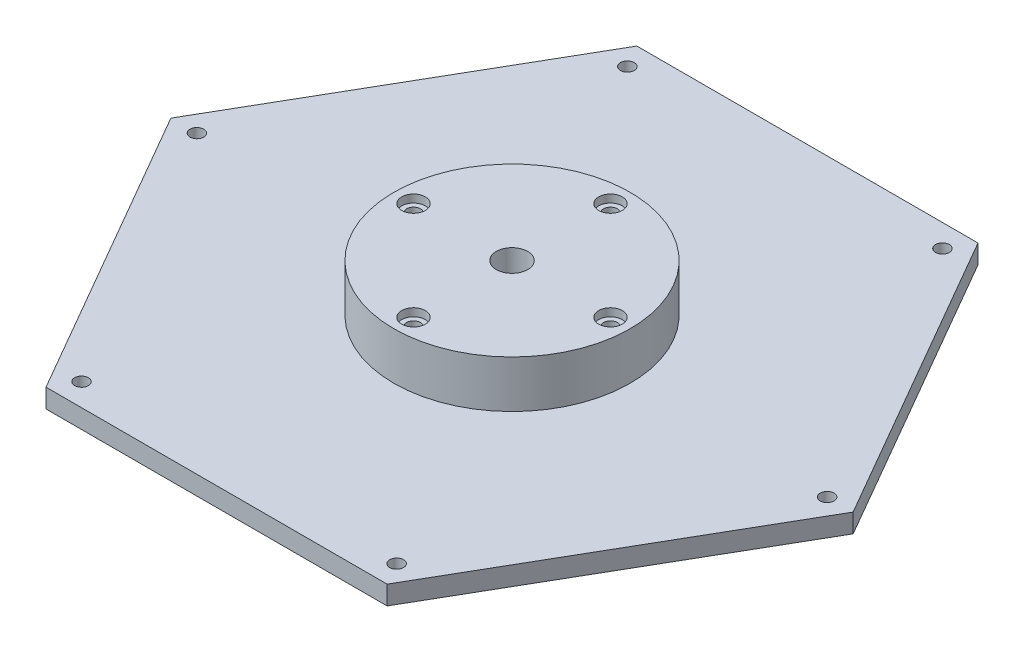
ISO-10303-21;
HEADER;
FILE_DESCRIPTION(('STEP AP214'),'2;1');
FILE_NAME('part.step','',(''),(''),'','','');
FILE_SCHEMA(('AUTOMOTIVE_DESIGN { 1 0 10303 214 1 1 1 1 }'));
ENDSEC;
DATA;
#1=APPLICATION_CONTEXT('core data for automotive mechanical design processes');
#2=APPLICATION_PROTOCOL_DEFINITION('international standard','automotive_design',2000,#1);
#3=PRODUCT_CONTEXT('',#1,'mechanical');
#4=PRODUCT('Part','Part','',(#3));
#5=PRODUCT_RELATED_PRODUCT_CATEGORY('part','',(#4));
#6=PRODUCT_DEFINITION_FORMATION('','',#4);
#7=PRODUCT_DEFINITION_CONTEXT('part definition',#1,'design');
#8=PRODUCT_DEFINITION('design','',#6,#7);
#9=PRODUCT_DEFINITION_SHAPE('','',#8);
#10=(LENGTH_UNIT() NAMED_UNIT(*) SI_UNIT(.MILLI.,.METRE.));
#11=(NAMED_UNIT(*) PLANE_ANGLE_UNIT() SI_UNIT($,.RADIAN.));
#12=(NAMED_UNIT(*) SI_UNIT($,.STERADIAN.) SOLID_ANGLE_UNIT());
#13=UNCERTAINTY_MEASURE_WITH_UNIT(LENGTH_MEASURE(1.E-05),#10,'distance_accuracy_value','');
#14=(GEOMETRIC_REPRESENTATION_CONTEXT(3) GLOBAL_UNCERTAINTY_ASSIGNED_CONTEXT((#13)) GLOBAL_UNIT_ASSIGNED_CONTEXT((#10,
#11,#12)) REPRESENTATION_CONTEXT('',''));
#15=CARTESIAN_POINT('',(0.,0.,0.));
#16=DIRECTION('',(0.,0.,1.));
#17=DIRECTION('',(1.,0.,0.));
#18=AXIS2_PLACEMENT_3D('',#15,#16,#17);
#19=CARTESIAN_POINT('',(25.,-4.94974746832857,0.));
#20=DIRECTION('',(0.,1.,0.));
#21=DIRECTION('',(0.,0.,1.));
#22=AXIS2_PLACEMENT_3D('',#19,#20,#21);
#23=CYLINDRICAL_SURFACE('',#22,1.75);
#24=CARTESIAN_POINT('',(25.,0.,0.));
#25=DIRECTION('',(0.,1.,0.));
#26=DIRECTION('',(0.,0.,1.));
#27=AXIS2_PLACEMENT_3D('',#24,#25,#26);
#28=CIRCLE('',#27,1.75);
#29=CARTESIAN_POINT('',(25.,0.,1.75));
#30=VERTEX_POINT('',#29);
#31=EDGE_CURVE('E189',#30,#30,#28,.F.);
#32=ORIENTED_EDGE('',*,*,#31,.T.);
#33=EDGE_LOOP('',(#32));
#34=FACE_BOUND('',#33,.T.);
#35=CARTESIAN_POINT('',(25.,14.8,0.));
#36=DIRECTION('',(0.,1.,0.));
#37=DIRECTION('',(0.,0.,1.));
#38=AXIS2_PLACEMENT_3D('',#35,#36,#37);
#39=CIRCLE('',#38,1.75);
#40=CARTESIAN_POINT('',(25.,14.8,1.75));
#41=VERTEX_POINT('',#40);
#42=EDGE_CURVE('E42',#41,#41,#39,.F.);
#43=ORIENTED_EDGE('',*,*,#42,.F.);
#44=EDGE_LOOP('',(#43));
#45=FACE_BOUND('',#44,.T.);
#46=ADVANCED_FACE('F38',(#34,#45),#23,.F.);
#47=CARTESIAN_POINT('',(2.61861100413235E-13,-4.94974746832857,-25.));
#48=DIRECTION('',(0.,1.,0.));
#49=DIRECTION('',(0.,0.,1.));
#50=AXIS2_PLACEMENT_3D('',#47,#48,#49);
#51=CYLINDRICAL_SURFACE('',#50,1.75);
#52=CARTESIAN_POINT('',(2.61861100413235E-13,0.,-25.));
#53=DIRECTION('',(0.,1.,0.));
#54=DIRECTION('',(0.,0.,1.));
#55=AXIS2_PLACEMENT_3D('',#52,#53,#54);
#56=CIRCLE('',#55,1.75);
#57=CARTESIAN_POINT('',(2.61861100413235E-13,0.,-23.25));
#58=VERTEX_POINT('',#57);
#59=EDGE_CURVE('E174',#58,#58,#56,.F.);
#60=ORIENTED_EDGE('',*,*,#59,.T.);
#61=EDGE_LOOP('',(#60));
#62=FACE_BOUND('',#61,.T.);
#63=CARTESIAN_POINT('',(2.61861100413235E-13,14.8,-25.));
#64=DIRECTION('',(0.,1.,0.));
#65=DIRECTION('',(0.,0.,1.));
#66=AXIS2_PLACEMENT_3D('',#63,#64,#65);
#67=CIRCLE('',#66,1.75);
#68=CARTESIAN_POINT('',(2.61861100413235E-13,14.8,-23.25));
#69=VERTEX_POINT('',#68);
#70=EDGE_CURVE('E151',#69,#69,#67,.F.);
#71=ORIENTED_EDGE('',*,*,#70,.F.);
#72=EDGE_LOOP('',(#71));
#73=FACE_BOUND('',#72,.T.);
#74=ADVANCED_FACE('F246',(#62,#73),#51,.F.);
#75=CARTESIAN_POINT('',(-25.,-4.94974746832857,-1.74574066942157E-13));
#76=DIRECTION('',(0.,1.,0.));
#77=DIRECTION('',(0.,0.,1.));
#78=AXIS2_PLACEMENT_3D('',#75,#76,#77);
#79=CYLINDRICAL_SURFACE('',#78,1.75);
#80=CARTESIAN_POINT('',(-25.,0.,-1.74574066942157E-13));
#81=DIRECTION('',(0.,1.,0.));
#82=DIRECTION('',(0.,0.,1.));
#83=AXIS2_PLACEMENT_3D('',#80,#81,#82);
#84=CIRCLE('',#83,1.75);
#85=CARTESIAN_POINT('',(-25.,0.,1.74999999999983));
#86=VERTEX_POINT('',#85);
#87=EDGE_CURVE('E180',#86,#86,#84,.F.);
#88=ORIENTED_EDGE('',*,*,#87,.T.);
#89=EDGE_LOOP('',(#88));
#90=FACE_BOUND('',#89,.T.);
#91=CARTESIAN_POINT('',(-25.,14.8,-1.74574066942157E-13));
#92=DIRECTION('',(0.,1.,0.));
#93=DIRECTION('',(0.,0.,1.));
#94=AXIS2_PLACEMENT_3D('',#91,#92,#93);
#95=CIRCLE('',#94,1.75);
#96=CARTESIAN_POINT('',(-25.,14.8,1.74999999999983));
#97=VERTEX_POINT('',#96);
#98=EDGE_CURVE('E148',#97,#97,#95,.F.);
#99=ORIENTED_EDGE('',*,*,#98,.F.);
#100=EDGE_LOOP('',(#99));
#101=FACE_BOUND('',#100,.T.);
#102=ADVANCED_FACE('F253',(#90,#101),#79,.F.);
#103=CARTESIAN_POINT('',(0.,-4.94974746832857,25.));
#104=DIRECTION('',(0.,1.,0.));
#105=DIRECTION('',(0.,0.,1.));
#106=AXIS2_PLACEMENT_3D('',#103,#104,#105);
#107=CYLINDRICAL_SURFACE('',#106,1.75);
#108=CARTESIAN_POINT('',(0.,0.,25.));
#109=DIRECTION('',(0.,1.,0.));
#110=DIRECTION('',(0.,0.,1.));
#111=AXIS2_PLACEMENT_3D('',#108,#109,#110);
#112=CIRCLE('',#111,1.75);
#113=CARTESIAN_POINT('',(0.,0.,26.75));
#114=VERTEX_POINT('',#113);
#115=EDGE_CURVE('E183',#114,#114,#112,.F.);
#116=ORIENTED_EDGE('',*,*,#115,.T.);
#117=EDGE_LOOP('',(#116));
#118=FACE_BOUND('',#117,.T.);
#119=CARTESIAN_POINT('',(0.,14.8,25.));
#120=DIRECTION('',(0.,1.,0.));
#121=DIRECTION('',(0.,0.,1.));
#122=AXIS2_PLACEMENT_3D('',#119,#120,#121);
#123=CIRCLE('',#122,1.75);
#124=CARTESIAN_POINT('',(0.,14.8,26.75));
#125=VERTEX_POINT('',#124);
#126=EDGE_CURVE('E145',#125,#125,#123,.F.);
#127=ORIENTED_EDGE('',*,*,#126,.F.);
#128=EDGE_LOOP('',(#127));
#129=FACE_BOUND('',#128,.T.);
#130=ADVANCED_FACE('F259',(#118,#129),#107,.F.);
#131=CARTESIAN_POINT('',(0.,4.8,0.));
#132=DIRECTION('',(0.,1.,0.));
#133=DIRECTION('',(0.,0.,1.));
#134=AXIS2_PLACEMENT_3D('',#131,#132,#133);
#135=PLANE('',#134);
#136=CARTESIAN_POINT('',(-79.9999999999961,4.8,7.02390780437483E-12));
#137=DIRECTION('',(0.,1.,0.));
#138=DIRECTION('',(0.,0.,1.));
#139=AXIS2_PLACEMENT_3D('',#136,#137,#138);
#140=CIRCLE('',#139,1.75000000000804);
#141=CARTESIAN_POINT('',(-79.9999999999961,4.8,1.75000000001507));
#142=VERTEX_POINT('',#141);
#143=EDGE_CURVE('E209',#142,#142,#140,.T.);
#144=ORIENTED_EDGE('',*,*,#143,.F.);
#145=EDGE_LOOP('',(#144));
#146=FACE_BOUND('',#145,.T.);
#147=CARTESIAN_POINT('',(-39.999999999992,4.8,69.2820323027597));
#148=DIRECTION('',(0.,1.,0.));
#149=DIRECTION('',(0.,0.,1.));
#150=AXIS2_PLACEMENT_3D('',#147,#148,#149);
#151=CIRCLE('',#150,1.75000000000657);
#152=CARTESIAN_POINT('',(-39.999999999992,4.8,71.0320323027663));
#153=VERTEX_POINT('',#152);
#154=EDGE_CURVE('E206',#153,#153,#151,.T.);
#155=ORIENTED_EDGE('',*,*,#154,.F.);
#156=EDGE_LOOP('',(#155));
#157=FACE_BOUND('',#156,.T.);
#158=CARTESIAN_POINT('',(40.000000000008,4.8,69.282032302755));
#159=DIRECTION('',(0.,1.,0.));
#160=DIRECTION('',(0.,0.,1.));
#161=AXIS2_PLACEMENT_3D('',#158,#159,#160);
#162=CIRCLE('',#161,1.75000000000203);
#163=CARTESIAN_POINT('',(40.000000000008,4.8,71.032032302757));
#164=VERTEX_POINT('',#163);
#165=EDGE_CURVE('E203',#164,#164,#162,.T.);
#166=ORIENTED_EDGE('',*,*,#165,.F.);
#167=EDGE_LOOP('',(#166));
#168=FACE_BOUND('',#167,.T.);
#169=CARTESIAN_POINT('',(80.0000000000039,4.8,-2.47318522616396E-12));
#170=DIRECTION('',(0.,1.,0.));
#171=DIRECTION('',(0.,0.,1.));
#172=AXIS2_PLACEMENT_3D('',#169,#170,#171);
#173=CIRCLE('',#172,1.74999999999882);
#174=CARTESIAN_POINT('',(80.0000000000039,4.8,1.74999999999634));
#175=VERTEX_POINT('',#174);
#176=EDGE_CURVE('E200',#175,#175,#173,.T.);
#177=ORIENTED_EDGE('',*,*,#176,.F.);
#178=EDGE_LOOP('',(#177));
#179=FACE_BOUND('',#178,.T.);
#180=CARTESIAN_POINT('',(39.9999999999998,4.8,-69.2820323027552));
#181=DIRECTION('',(0.,1.,0.));
#182=DIRECTION('',(0.,0.,1.));
#183=AXIS2_PLACEMENT_3D('',#180,#181,#182);
#184=CIRCLE('',#183,1.75);
#185=CARTESIAN_POINT('',(39.9999999999998,4.8,-67.5320323027552));
#186=VERTEX_POINT('',#185);
#187=EDGE_CURVE('E197',#186,#186,#184,.T.);
#188=ORIENTED_EDGE('',*,*,#187,.F.);
#189=EDGE_LOOP('',(#188));
#190=FACE_BOUND('',#189,.T.);
#191=CARTESIAN_POINT('',(-40.0000000000002,4.8,-69.2820323027504));
#192=DIRECTION('',(0.,1.,0.));
#193=DIRECTION('',(0.,0.,1.));
#194=AXIS2_PLACEMENT_3D('',#191,#192,#193);
#195=CIRCLE('',#194,1.75000000000515);
#196=CARTESIAN_POINT('',(-40.0000000000002,4.8,-67.5320323027453));
#197=VERTEX_POINT('',#196);
#198=EDGE_CURVE('E194',#197,#197,#195,.T.);
#199=ORIENTED_EDGE('',*,*,#198,.F.);
#200=EDGE_LOOP('',(#199));
#201=FACE_BOUND('',#200,.T.);
#202=CARTESIAN_POINT('',(0.,4.8,0.));
#203=DIRECTION('',(0.,1.,0.));
#204=DIRECTION('',(0.,0.,1.));
#205=AXIS2_PLACEMENT_3D('',#202,#203,#204);
#206=CIRCLE('',#205,30.);
#207=CARTESIAN_POINT('',(0.,4.8,30.));
#208=VERTEX_POINT('',#207);
#209=EDGE_CURVE('E11',#208,#208,#206,.T.);
#210=ORIENTED_EDGE('',*,*,#209,.F.);
#211=EDGE_LOOP('',(#210));
#212=FACE_BOUND('',#211,.T.);
#213=DIRECTION('',(0.499999999999995,0.,-0.866025403784442));
#214=VECTOR('',#213,1.);
#215=CARTESIAN_POINT('',(43.3012701892227,4.8,74.9999999999992));
#216=LINE('',#215,#214);
#217=CARTESIAN_POINT('',(43.3012701892227,4.8,74.9999999999992));
#218=VERTEX_POINT('',#217);
#219=CARTESIAN_POINT('',(86.6025403784436,4.8,0.));
#220=VERTEX_POINT('',#219);
#221=EDGE_CURVE('E137',#218,#220,#216,.T.);
#222=ORIENTED_EDGE('',*,*,#221,.T.);
#223=DIRECTION('',(-0.500000000000001,0.,-0.866025403784438));
#224=VECTOR('',#223,1.);
#225=CARTESIAN_POINT('',(86.6025403784436,4.8,0.));
#226=LINE('',#225,#224);
#227=CARTESIAN_POINT('',(43.3012701892216,4.8,-74.9999999999998));
#228=VERTEX_POINT('',#227);
#229=EDGE_CURVE('E95',#220,#228,#226,.T.);
#230=ORIENTED_EDGE('',*,*,#229,.T.);
#231=DIRECTION('',(-1.,0.,0.));
#232=VECTOR('',#231,1.);
#233=CARTESIAN_POINT('',(43.3012701892216,4.8,-74.9999999999998));
#234=LINE('',#233,#232);
#235=CARTESIAN_POINT('',(-43.3012701892221,4.8,-74.9999999999996));
#236=VERTEX_POINT('',#235);
#237=EDGE_CURVE('E108',#228,#236,#234,.T.);
#238=ORIENTED_EDGE('',*,*,#237,.T.);
#239=DIRECTION('',(-0.499999999999995,0.,0.866025403784442));
#240=VECTOR('',#239,1.);
#241=CARTESIAN_POINT('',(-43.3012701892221,4.8,-74.9999999999996));
#242=LINE('',#241,#240);
#243=CARTESIAN_POINT('',(-86.6025403784436,4.8,6.04742307255489E-13));
#244=VERTEX_POINT('',#243);
#245=EDGE_CURVE('E102',#236,#244,#242,.T.);
#246=ORIENTED_EDGE('',*,*,#245,.T.);
#247=DIRECTION('',(0.500000000000007,0.,0.866025403784435));
#248=VECTOR('',#247,1.);
#249=CARTESIAN_POINT('',(-86.6025403784436,4.8,6.04742307255489E-13));
#250=LINE('',#249,#248);
#251=CARTESIAN_POINT('',(-43.3012701892211,4.8,75.0000000000001));
#252=VERTEX_POINT('',#251);
#253=EDGE_CURVE('E106',#244,#252,#250,.T.);
#254=ORIENTED_EDGE('',*,*,#253,.T.);
#255=DIRECTION('',(1.,0.,0.));
#256=VECTOR('',#255,1.);
#257=CARTESIAN_POINT('',(-43.3012701892211,4.8,75.0000000000001));
#258=LINE('',#257,#256);
#259=EDGE_CURVE('E57',#252,#218,#258,.T.);
#260=ORIENTED_EDGE('',*,*,#259,.T.);
#261=EDGE_LOOP('',(#222,#230,#238,#246,#254,#260));
#262=FACE_BOUND('',#261,.T.);
#263=ADVANCED_FACE('F104',(#146,#157,#168,#179,#190,#201,#212,#262),#135,.T.);
#264=CARTESIAN_POINT('',(0.,0.,0.));
#265=DIRECTION('',(0.,1.,0.));
#266=DIRECTION('',(0.,0.,1.));
#267=AXIS2_PLACEMENT_3D('',#264,#265,#266);
#268=PLANE('',#267);
#269=CARTESIAN_POINT('',(-79.9999999999961,0.,7.02390780437483E-12));
#270=DIRECTION('',(0.,1.,0.));
#271=DIRECTION('',(0.,0.,1.));
#272=AXIS2_PLACEMENT_3D('',#269,#270,#271);
#273=CIRCLE('',#272,1.75000000000804);
#274=CARTESIAN_POINT('',(-79.9999999999961,0.,1.75000000001507));
#275=VERTEX_POINT('',#274);
#276=EDGE_CURVE('E160',#275,#275,#273,.F.);
#277=ORIENTED_EDGE('',*,*,#276,.F.);
#278=EDGE_LOOP('',(#277));
#279=FACE_BOUND('',#278,.T.);
#280=CARTESIAN_POINT('',(-39.999999999992,0.,69.2820323027597));
#281=DIRECTION('',(0.,1.,0.));
#282=DIRECTION('',(0.,0.,1.));
#283=AXIS2_PLACEMENT_3D('',#280,#281,#282);
#284=CIRCLE('',#283,1.75000000000657);
#285=CARTESIAN_POINT('',(-39.999999999992,0.,71.0320323027663));
#286=VERTEX_POINT('',#285);
#287=EDGE_CURVE('E165',#286,#286,#284,.F.);
#288=ORIENTED_EDGE('',*,*,#287,.F.);
#289=EDGE_LOOP('',(#288));
#290=FACE_BOUND('',#289,.T.);
#291=CARTESIAN_POINT('',(40.000000000008,0.,69.282032302755));
#292=DIRECTION('',(0.,1.,0.));
#293=DIRECTION('',(0.,0.,1.));
#294=AXIS2_PLACEMENT_3D('',#291,#292,#293);
#295=CIRCLE('',#294,1.75000000000203);
#296=CARTESIAN_POINT('',(40.000000000008,0.,71.032032302757));
#297=VERTEX_POINT('',#296);
#298=EDGE_CURVE('E175',#297,#297,#295,.F.);
#299=ORIENTED_EDGE('',*,*,#298,.F.);
#300=EDGE_LOOP('',(#299));
#301=FACE_BOUND('',#300,.T.);
#302=CARTESIAN_POINT('',(80.0000000000039,0.,-2.47318522616396E-12));
#303=DIRECTION('',(0.,1.,0.));
#304=DIRECTION('',(0.,0.,1.));
#305=AXIS2_PLACEMENT_3D('',#302,#303,#304);
#306=CIRCLE('',#305,1.74999999999882);
#307=CARTESIAN_POINT('',(80.0000000000039,0.,1.74999999999634));
#308=VERTEX_POINT('',#307);
#309=EDGE_CURVE('E171',#308,#308,#306,.F.);
#310=ORIENTED_EDGE('',*,*,#309,.F.);
#311=EDGE_LOOP('',(#310));
#312=FACE_BOUND('',#311,.T.);
#313=CARTESIAN_POINT('',(39.9999999999998,0.,-69.2820323027552));
#314=DIRECTION('',(0.,1.,0.));
#315=DIRECTION('',(0.,0.,1.));
#316=AXIS2_PLACEMENT_3D('',#313,#314,#315);
#317=CIRCLE('',#316,1.75);
#318=CARTESIAN_POINT('',(39.9999999999998,0.,-67.5320323027552));
#319=VERTEX_POINT('',#318);
#320=EDGE_CURVE('E186',#319,#319,#317,.F.);
#321=ORIENTED_EDGE('',*,*,#320,.F.);
#322=EDGE_LOOP('',(#321));
#323=FACE_BOUND('',#322,.T.);
#324=ORIENTED_EDGE('',*,*,#115,.F.);
#325=EDGE_LOOP('',(#324));
#326=FACE_BOUND('',#325,.T.);
#327=ORIENTED_EDGE('',*,*,#87,.F.);
#328=EDGE_LOOP('',(#327));
#329=FACE_BOUND('',#328,.T.);
#330=ORIENTED_EDGE('',*,*,#59,.F.);
#331=EDGE_LOOP('',(#330));
#332=FACE_BOUND('',#331,.T.);
#333=CARTESIAN_POINT('',(-40.0000000000002,0.,-69.2820323027504));
#334=DIRECTION('',(0.,1.,0.));
#335=DIRECTION('',(0.,0.,1.));
#336=AXIS2_PLACEMENT_3D('',#333,#334,#335);
#337=CIRCLE('',#336,1.75000000000515);
#338=CARTESIAN_POINT('',(-40.0000000000002,0.,-67.5320323027453));
#339=VERTEX_POINT('',#338);
#340=EDGE_CURVE('E156',#339,#339,#337,.F.);
#341=ORIENTED_EDGE('',*,*,#340,.F.);
#342=EDGE_LOOP('',(#341));
#343=FACE_BOUND('',#342,.T.);
#344=ORIENTED_EDGE('',*,*,#31,.F.);
#345=EDGE_LOOP('',(#344));
#346=FACE_BOUND('',#345,.T.);
#347=DIRECTION('',(0.499999999999995,0.,-0.866025403784442));
#348=VECTOR('',#347,1.);
#349=CARTESIAN_POINT('',(43.3012701892227,0.,74.9999999999992));
#350=LINE('',#349,#348);
#351=CARTESIAN_POINT('',(43.3012701892227,0.,74.9999999999992));
#352=VERTEX_POINT('',#351);
#353=CARTESIAN_POINT('',(86.6025403784436,0.,0.));
#354=VERTEX_POINT('',#353);
#355=EDGE_CURVE('E126',#352,#354,#350,.T.);
#356=ORIENTED_EDGE('',*,*,#355,.F.);
#357=DIRECTION('',(1.,0.,0.));
#358=VECTOR('',#357,1.);
#359=CARTESIAN_POINT('',(-43.3012701892211,0.,75.0000000000001));
#360=LINE('',#359,#358);
#361=CARTESIAN_POINT('',(-43.3012701892211,0.,75.0000000000001));
#362=VERTEX_POINT('',#361);
#363=EDGE_CURVE('E86',#362,#352,#360,.T.);
#364=ORIENTED_EDGE('',*,*,#363,.F.);
#365=DIRECTION('',(0.500000000000007,0.,0.866025403784435));
#366=VECTOR('',#365,1.);
#367=CARTESIAN_POINT('',(-86.6025403784436,0.,6.04742307255489E-13));
#368=LINE('',#367,#366);
#369=CARTESIAN_POINT('',(-86.6025403784436,0.,6.04742307255489E-13));
#370=VERTEX_POINT('',#369);
#371=EDGE_CURVE('E80',#370,#362,#368,.T.);
#372=ORIENTED_EDGE('',*,*,#371,.F.);
#373=DIRECTION('',(-0.499999999999995,0.,0.866025403784442));
#374=VECTOR('',#373,1.);
#375=CARTESIAN_POINT('',(-43.3012701892221,0.,-74.9999999999996));
#376=LINE('',#375,#374);
#377=CARTESIAN_POINT('',(-43.3012701892221,0.,-74.9999999999996));
#378=VERTEX_POINT('',#377);
#379=EDGE_CURVE('E116',#378,#370,#376,.T.);
#380=ORIENTED_EDGE('',*,*,#379,.F.);
#381=DIRECTION('',(-1.,0.,0.));
#382=VECTOR('',#381,1.);
#383=CARTESIAN_POINT('',(43.3012701892216,0.,-74.9999999999998));
#384=LINE('',#383,#382);
#385=CARTESIAN_POINT('',(43.3012701892216,0.,-74.9999999999998));
#386=VERTEX_POINT('',#385);
#387=EDGE_CURVE('E132',#386,#378,#384,.T.);
#388=ORIENTED_EDGE('',*,*,#387,.F.);
#389=DIRECTION('',(-0.500000000000001,0.,-0.866025403784438));
#390=VECTOR('',#389,1.);
#391=CARTESIAN_POINT('',(86.6025403784436,0.,0.));
#392=LINE('',#391,#390);
#393=EDGE_CURVE('E129',#354,#386,#392,.T.);
#394=ORIENTED_EDGE('',*,*,#393,.F.);
#395=EDGE_LOOP('',(#356,#364,#372,#380,#388,#394));
#396=FACE_BOUND('',#395,.T.);
#397=CARTESIAN_POINT('',(0.,0.,0.));
#398=DIRECTION('',(0.,1.,0.));
#399=DIRECTION('',(0.,0.,1.));
#400=AXIS2_PLACEMENT_3D('',#397,#398,#399);
#401=CIRCLE('',#400,4.);
#402=CARTESIAN_POINT('',(0.,0.,4.));
#403=VERTEX_POINT('',#402);
#404=EDGE_CURVE('E130',#403,#403,#401,.T.);
#405=ORIENTED_EDGE('',*,*,#404,.T.);
#406=EDGE_LOOP('',(#405));
#407=FACE_BOUND('',#406,.T.);
#408=ADVANCED_FACE('F229',(#279,#290,#301,#312,#323,#326,#329,#332,#343,#346,#396,#407),#268,.F.);
#409=CARTESIAN_POINT('',(43.3012701892227,4.8,74.9999999999992));
#410=DIRECTION('',(-0.866025403784441,0.,-0.499999999999995));
#411=DIRECTION('',(-0.499999999999995,0.,0.866025403784442));
#412=AXIS2_PLACEMENT_3D('',#409,#410,#411);
#413=PLANE('',#412);
#414=ORIENTED_EDGE('',*,*,#355,.T.);
#415=DIRECTION('',(0.,-1.,0.));
#416=VECTOR('',#415,1.);
#417=CARTESIAN_POINT('',(86.6025403784436,4.8,0.));
#418=LINE('',#417,#416);
#419=EDGE_CURVE('E48',#220,#354,#418,.T.);
#420=ORIENTED_EDGE('',*,*,#419,.F.);
#421=ORIENTED_EDGE('',*,*,#221,.F.);
#422=DIRECTION('',(0.,-1.,0.));
#423=VECTOR('',#422,1.);
#424=CARTESIAN_POINT('',(43.3012701892227,4.8,74.9999999999992));
#425=LINE('',#424,#423);
#426=EDGE_CURVE('E122',#218,#352,#425,.T.);
#427=ORIENTED_EDGE('',*,*,#426,.T.);
#428=EDGE_LOOP('',(#414,#420,#421,#427));
#429=FACE_BOUND('',#428,.T.);
#430=ADVANCED_FACE('F40',(#429),#413,.F.);
#431=CARTESIAN_POINT('',(86.6025403784436,4.8,0.));
#432=DIRECTION('',(-0.866025403784438,0.,0.500000000000001));
#433=DIRECTION('',(0.500000000000001,0.,0.866025403784438));
#434=AXIS2_PLACEMENT_3D('',#431,#432,#433);
#435=PLANE('',#434);
#436=ORIENTED_EDGE('',*,*,#393,.T.);
#437=DIRECTION('',(0.,-1.,0.));
#438=VECTOR('',#437,1.);
#439=CARTESIAN_POINT('',(43.3012701892216,4.8,-74.9999999999998));
#440=LINE('',#439,#438);
#441=EDGE_CURVE('E141',#228,#386,#440,.T.);
#442=ORIENTED_EDGE('',*,*,#441,.F.);
#443=ORIENTED_EDGE('',*,*,#229,.F.);
#444=ORIENTED_EDGE('',*,*,#419,.T.);
#445=EDGE_LOOP('',(#436,#442,#443,#444));
#446=FACE_BOUND('',#445,.T.);
#447=ADVANCED_FACE('F223',(#446),#435,.F.);
#448=CARTESIAN_POINT('',(43.3012701892216,4.8,-74.9999999999998));
#449=DIRECTION('',(0.,0.,1.));
#450=DIRECTION('',(1.,0.,0.));
#451=AXIS2_PLACEMENT_3D('',#448,#449,#450);
#452=PLANE('',#451);
#453=ORIENTED_EDGE('',*,*,#387,.T.);
#454=DIRECTION('',(0.,-1.,0.));
#455=VECTOR('',#454,1.);
#456=CARTESIAN_POINT('',(-43.3012701892221,4.8,-74.9999999999996));
#457=LINE('',#456,#455);
#458=EDGE_CURVE('E117',#236,#378,#457,.T.);
#459=ORIENTED_EDGE('',*,*,#458,.F.);
#460=ORIENTED_EDGE('',*,*,#237,.F.);
#461=ORIENTED_EDGE('',*,*,#441,.T.);
#462=EDGE_LOOP('',(#453,#459,#460,#461));
#463=FACE_BOUND('',#462,.T.);
#464=ADVANCED_FACE('F226',(#463),#452,.F.);
#465=CARTESIAN_POINT('',(-43.3012701892221,4.8,-74.9999999999996));
#466=DIRECTION('',(0.866025403784442,0.,0.499999999999995));
#467=DIRECTION('',(0.499999999999995,0.,-0.866025403784442));
#468=AXIS2_PLACEMENT_3D('',#465,#466,#467);
#469=PLANE('',#468);
#470=ORIENTED_EDGE('',*,*,#379,.T.);
#471=DIRECTION('',(0.,-1.,0.));
#472=VECTOR('',#471,1.);
#473=CARTESIAN_POINT('',(-86.6025403784436,4.8,6.04742307255489E-13));
#474=LINE('',#473,#472);
#475=EDGE_CURVE('E113',#244,#370,#474,.T.);
#476=ORIENTED_EDGE('',*,*,#475,.F.);
#477=ORIENTED_EDGE('',*,*,#245,.F.);
#478=ORIENTED_EDGE('',*,*,#458,.T.);
#479=EDGE_LOOP('',(#470,#476,#477,#478));
#480=FACE_BOUND('',#479,.T.);
#481=ADVANCED_FACE('F114',(#480),#469,.F.);
#482=CARTESIAN_POINT('',(-86.6025403784436,4.8,6.04742307255489E-13));
#483=DIRECTION('',(0.866025403784434,0.,-0.500000000000007));
#484=DIRECTION('',(-0.500000000000007,0.,-0.866025403784435));
#485=AXIS2_PLACEMENT_3D('',#482,#483,#484);
#486=PLANE('',#485);
#487=ORIENTED_EDGE('',*,*,#371,.T.);
#488=DIRECTION('',(0.,-1.,0.));
#489=VECTOR('',#488,1.);
#490=CARTESIAN_POINT('',(-43.3012701892211,4.8,75.0000000000001));
#491=LINE('',#490,#489);
#492=EDGE_CURVE('E118',#252,#362,#491,.T.);
#493=ORIENTED_EDGE('',*,*,#492,.F.);
#494=ORIENTED_EDGE('',*,*,#253,.F.);
#495=ORIENTED_EDGE('',*,*,#475,.T.);
#496=EDGE_LOOP('',(#487,#493,#494,#495));
#497=FACE_BOUND('',#496,.T.);
#498=ADVANCED_FACE('F120',(#497),#486,.F.);
#499=CARTESIAN_POINT('',(-43.3012701892211,4.8,75.0000000000001));
#500=DIRECTION('',(0.,0.,-1.));
#501=DIRECTION('',(-1.,0.,0.));
#502=AXIS2_PLACEMENT_3D('',#499,#500,#501);
#503=PLANE('',#502);
#504=ORIENTED_EDGE('',*,*,#363,.T.);
#505=ORIENTED_EDGE('',*,*,#426,.F.);
#506=ORIENTED_EDGE('',*,*,#259,.F.);
#507=ORIENTED_EDGE('',*,*,#492,.T.);
#508=EDGE_LOOP('',(#504,#505,#506,#507));
#509=FACE_BOUND('',#508,.T.);
#510=ADVANCED_FACE('F232',(#509),#503,.F.);
#511=CARTESIAN_POINT('',(0.,4.8,0.));
#512=DIRECTION('',(0.,-1.,0.));
#513=DIRECTION('',(0.,0.,-1.));
#514=AXIS2_PLACEMENT_3D('',#511,#512,#513);
#515=CYLINDRICAL_SURFACE('',#514,4.);
#516=ORIENTED_EDGE('',*,*,#404,.F.);
#517=EDGE_LOOP('',(#516));
#518=FACE_BOUND('',#517,.T.);
#519=CARTESIAN_POINT('',(0.,16.8,0.));
#520=DIRECTION('',(0.,1.,0.));
#521=DIRECTION('',(0.,0.,1.));
#522=AXIS2_PLACEMENT_3D('',#519,#520,#521);
#523=CIRCLE('',#522,4.);
#524=CARTESIAN_POINT('',(0.,16.8,4.));
#525=VERTEX_POINT('',#524);
#526=EDGE_CURVE('E212',#525,#525,#523,.T.);
#527=ORIENTED_EDGE('',*,*,#526,.T.);
#528=EDGE_LOOP('',(#527));
#529=FACE_BOUND('',#528,.T.);
#530=ADVANCED_FACE('F234',(#518,#529),#515,.F.);
#531=CARTESIAN_POINT('',(0.,16.8,0.));
#532=DIRECTION('',(0.,1.,0.));
#533=DIRECTION('',(0.,0.,1.));
#534=AXIS2_PLACEMENT_3D('',#531,#532,#533);
#535=PLANE('',#534);
#536=CARTESIAN_POINT('',(2.61861100413235E-13,16.8,-25.));
#537=DIRECTION('',(0.,1.,0.));
#538=DIRECTION('',(0.,0.,1.));
#539=AXIS2_PLACEMENT_3D('',#536,#537,#538);
#540=CIRCLE('',#539,3.);
#541=CARTESIAN_POINT('',(2.61861100413235E-13,16.8,-22.));
#542=VERTEX_POINT('',#541);
#543=EDGE_CURVE('E442',#542,#542,#540,.T.);
#544=ORIENTED_EDGE('',*,*,#543,.F.);
#545=EDGE_LOOP('',(#544));
#546=FACE_BOUND('',#545,.T.);
#547=CARTESIAN_POINT('',(25.0000000000007,16.8,-4.3949678435326E-13));
#548=DIRECTION('',(0.,1.,0.));
#549=DIRECTION('',(0.,0.,1.));
#550=AXIS2_PLACEMENT_3D('',#547,#548,#549);
#551=CIRCLE('',#550,3.00000000000055);
#552=CARTESIAN_POINT('',(25.0000000000007,16.8,3.00000000000011));
#553=VERTEX_POINT('',#552);
#554=EDGE_CURVE('E438',#553,#553,#551,.T.);
#555=ORIENTED_EDGE('',*,*,#554,.F.);
#556=EDGE_LOOP('',(#555));
#557=FACE_BOUND('',#556,.T.);
#558=CARTESIAN_POINT('',(1.14085466911975E-12,16.8,25.));
#559=DIRECTION('',(0.,1.,0.));
#560=DIRECTION('',(0.,0.,1.));
#561=AXIS2_PLACEMENT_3D('',#558,#559,#560);
#562=CIRCLE('',#561,3.00000000000151);
#563=CARTESIAN_POINT('',(1.14085466911975E-12,16.8,28.0000000000015));
#564=VERTEX_POINT('',#563);
#565=EDGE_CURVE('E445',#564,#564,#562,.T.);
#566=ORIENTED_EDGE('',*,*,#565,.F.);
#567=EDGE_LOOP('',(#566));
#568=FACE_BOUND('',#567,.T.);
#569=CARTESIAN_POINT('',(-24.9999999999993,16.8,4.42558401351128E-13));
#570=DIRECTION('',(0.,1.,0.));
#571=DIRECTION('',(0.,0.,1.));
#572=AXIS2_PLACEMENT_3D('',#569,#570,#571);
#573=CIRCLE('',#572,3.00000000000113);
#574=CARTESIAN_POINT('',(-24.9999999999993,16.8,3.00000000000157));
#575=VERTEX_POINT('',#574);
#576=EDGE_CURVE('E169',#575,#575,#573,.T.);
#577=ORIENTED_EDGE('',*,*,#576,.F.);
#578=EDGE_LOOP('',(#577));
#579=FACE_BOUND('',#578,.T.);
#580=CARTESIAN_POINT('',(0.,16.8,0.));
#581=DIRECTION('',(0.,1.,0.));
#582=DIRECTION('',(0.,0.,1.));
#583=AXIS2_PLACEMENT_3D('',#580,#581,#582);
#584=CIRCLE('',#583,30.);
#585=CARTESIAN_POINT('',(0.,16.8,30.));
#586=VERTEX_POINT('',#585);
#587=EDGE_CURVE('E215',#586,#586,#584,.T.);
#588=ORIENTED_EDGE('',*,*,#587,.T.);
#589=EDGE_LOOP('',(#588));
#590=FACE_BOUND('',#589,.T.);
#591=ORIENTED_EDGE('',*,*,#526,.F.);
#592=EDGE_LOOP('',(#591));
#593=FACE_BOUND('',#592,.T.);
#594=ADVANCED_FACE('F240',(#546,#557,#568,#579,#590,#593),#535,.T.);
#595=CARTESIAN_POINT('',(0.,16.8,0.));
#596=DIRECTION('',(0.,-1.,0.));
#597=DIRECTION('',(0.,0.,-1.));
#598=AXIS2_PLACEMENT_3D('',#595,#596,#597);
#599=CYLINDRICAL_SURFACE('',#598,30.);
#600=ORIENTED_EDGE('',*,*,#587,.F.);
#601=EDGE_LOOP('',(#600));
#602=FACE_BOUND('',#601,.T.);
#603=ORIENTED_EDGE('',*,*,#209,.T.);
#604=EDGE_LOOP('',(#603));
#605=FACE_BOUND('',#604,.T.);
#606=ADVANCED_FACE('F263',(#602,#605),#599,.T.);
#607=CARTESIAN_POINT('',(-40.0000000000002,-4.94974746832857,-69.2820323027504));
#608=DIRECTION('',(0.,1.,0.));
#609=DIRECTION('',(0.,0.,1.));
#610=AXIS2_PLACEMENT_3D('',#607,#608,#609);
#611=CYLINDRICAL_SURFACE('',#610,1.75000000000515);
#612=ORIENTED_EDGE('',*,*,#198,.T.);
#613=EDGE_LOOP('',(#612));
#614=FACE_BOUND('',#613,.T.);
#615=ORIENTED_EDGE('',*,*,#340,.T.);
#616=EDGE_LOOP('',(#615));
#617=FACE_BOUND('',#616,.T.);
#618=ADVANCED_FACE('F265',(#614,#617),#611,.F.);
#619=CARTESIAN_POINT('',(39.9999999999998,-4.94974746832857,-69.2820323027552));
#620=DIRECTION('',(0.,1.,0.));
#621=DIRECTION('',(0.,0.,1.));
#622=AXIS2_PLACEMENT_3D('',#619,#620,#621);
#623=CYLINDRICAL_SURFACE('',#622,1.75);
#624=ORIENTED_EDGE('',*,*,#187,.T.);
#625=EDGE_LOOP('',(#624));
#626=FACE_BOUND('',#625,.T.);
#627=ORIENTED_EDGE('',*,*,#320,.T.);
#628=EDGE_LOOP('',(#627));
#629=FACE_BOUND('',#628,.T.);
#630=ADVANCED_FACE('F322',(#626,#629),#623,.F.);
#631=CARTESIAN_POINT('',(80.0000000000039,-4.94974746832857,-2.47318522616396E-12));
#632=DIRECTION('',(0.,1.,0.));
#633=DIRECTION('',(0.,0.,1.));
#634=AXIS2_PLACEMENT_3D('',#631,#632,#633);
#635=CYLINDRICAL_SURFACE('',#634,1.74999999999882);
#636=ORIENTED_EDGE('',*,*,#176,.T.);
#637=EDGE_LOOP('',(#636));
#638=FACE_BOUND('',#637,.T.);
#639=ORIENTED_EDGE('',*,*,#309,.T.);
#640=EDGE_LOOP('',(#639));
#641=FACE_BOUND('',#640,.T.);
#642=ADVANCED_FACE('F324',(#638,#641),#635,.F.);
#643=CARTESIAN_POINT('',(40.000000000008,-4.94974746832857,69.282032302755));
#644=DIRECTION('',(0.,1.,0.));
#645=DIRECTION('',(0.,0.,1.));
#646=AXIS2_PLACEMENT_3D('',#643,#644,#645);
#647=CYLINDRICAL_SURFACE('',#646,1.75000000000203);
#648=ORIENTED_EDGE('',*,*,#165,.T.);
#649=EDGE_LOOP('',(#648));
#650=FACE_BOUND('',#649,.T.);
#651=ORIENTED_EDGE('',*,*,#298,.T.);
#652=EDGE_LOOP('',(#651));
#653=FACE_BOUND('',#652,.T.);
#654=ADVANCED_FACE('F327',(#650,#653),#647,.F.);
#655=CARTESIAN_POINT('',(-39.999999999992,-4.94974746832857,69.2820323027597));
#656=DIRECTION('',(0.,1.,0.));
#657=DIRECTION('',(0.,0.,1.));
#658=AXIS2_PLACEMENT_3D('',#655,#656,#657);
#659=CYLINDRICAL_SURFACE('',#658,1.75000000000657);
#660=ORIENTED_EDGE('',*,*,#154,.T.);
#661=EDGE_LOOP('',(#660));
#662=FACE_BOUND('',#661,.T.);
#663=ORIENTED_EDGE('',*,*,#287,.T.);
#664=EDGE_LOOP('',(#663));
#665=FACE_BOUND('',#664,.T.);
#666=ADVANCED_FACE('F331',(#662,#665),#659,.F.);
#667=CARTESIAN_POINT('',(-79.9999999999961,-4.94974746832857,7.02390780437483E-12));
#668=DIRECTION('',(0.,1.,0.));
#669=DIRECTION('',(0.,0.,1.));
#670=AXIS2_PLACEMENT_3D('',#667,#668,#669);
#671=CYLINDRICAL_SURFACE('',#670,1.75000000000804);
#672=ORIENTED_EDGE('',*,*,#143,.T.);
#673=EDGE_LOOP('',(#672));
#674=FACE_BOUND('',#673,.T.);
#675=ORIENTED_EDGE('',*,*,#276,.T.);
#676=EDGE_LOOP('',(#675));
#677=FACE_BOUND('',#676,.T.);
#678=ADVANCED_FACE('F335',(#674,#677),#671,.F.);
#679=CARTESIAN_POINT('',(1.14085466911975E-12,14.8,25.));
#680=DIRECTION('',(0.,1.,0.));
#681=DIRECTION('',(0.,0.,1.));
#682=AXIS2_PLACEMENT_3D('',#679,#680,#681);
#683=PLANE('',#682);
#684=CARTESIAN_POINT('',(1.14085466911975E-12,14.8,25.));
#685=DIRECTION('',(0.,1.,0.));
#686=DIRECTION('',(0.,0.,1.));
#687=AXIS2_PLACEMENT_3D('',#684,#685,#686);
#688=CIRCLE('',#687,3.00000000000151);
#689=CARTESIAN_POINT('',(1.14085466911975E-12,14.8,28.0000000000015));
#690=VERTEX_POINT('',#689);
#691=EDGE_CURVE('E440',#690,#690,#688,.T.);
#692=ORIENTED_EDGE('',*,*,#691,.T.);
#693=EDGE_LOOP('',(#692));
#694=FACE_BOUND('',#693,.T.);
#695=ORIENTED_EDGE('',*,*,#126,.T.);
#696=EDGE_LOOP('',(#695));
#697=FACE_BOUND('',#696,.T.);
#698=ADVANCED_FACE('F314',(#694,#697),#683,.T.);
#699=CARTESIAN_POINT('',(1.14085466911975E-12,14.8,25.));
#700=DIRECTION('',(0.,1.,0.));
#701=DIRECTION('',(0.,0.,1.));
#702=AXIS2_PLACEMENT_3D('',#699,#700,#701);
#703=CYLINDRICAL_SURFACE('',#702,3.00000000000151);
#704=ORIENTED_EDGE('',*,*,#691,.F.);
#705=EDGE_LOOP('',(#704));
#706=FACE_BOUND('',#705,.T.);
#707=ORIENTED_EDGE('',*,*,#565,.T.);
#708=EDGE_LOOP('',(#707));
#709=FACE_BOUND('',#708,.T.);
#710=ADVANCED_FACE('F304',(#706,#709),#703,.F.);
#711=CARTESIAN_POINT('',(-24.9999999999993,14.8,4.42558401351128E-13));
#712=DIRECTION('',(0.,1.,0.));
#713=DIRECTION('',(0.,0.,1.));
#714=AXIS2_PLACEMENT_3D('',#711,#712,#713);
#715=PLANE('',#714);
#716=CARTESIAN_POINT('',(-24.9999999999993,14.8,4.42558401351128E-13));
#717=DIRECTION('',(0.,1.,0.));
#718=DIRECTION('',(0.,0.,1.));
#719=AXIS2_PLACEMENT_3D('',#716,#717,#718);
#720=CIRCLE('',#719,3.00000000000113);
#721=CARTESIAN_POINT('',(-24.9999999999993,14.8,3.00000000000157));
#722=VERTEX_POINT('',#721);
#723=EDGE_CURVE('E450',#722,#722,#720,.T.);
#724=ORIENTED_EDGE('',*,*,#723,.T.);
#725=EDGE_LOOP('',(#724));
#726=FACE_BOUND('',#725,.T.);
#727=ORIENTED_EDGE('',*,*,#98,.T.);
#728=EDGE_LOOP('',(#727));
#729=FACE_BOUND('',#728,.T.);
#730=ADVANCED_FACE('F301',(#726,#729),#715,.T.);
#731=CARTESIAN_POINT('',(-24.9999999999993,14.8,4.42558401351128E-13));
#732=DIRECTION('',(0.,1.,0.));
#733=DIRECTION('',(0.,0.,1.));
#734=AXIS2_PLACEMENT_3D('',#731,#732,#733);
#735=CYLINDRICAL_SURFACE('',#734,3.00000000000113);
#736=ORIENTED_EDGE('',*,*,#723,.F.);
#737=EDGE_LOOP('',(#736));
#738=FACE_BOUND('',#737,.T.);
#739=ORIENTED_EDGE('',*,*,#576,.T.);
#740=EDGE_LOOP('',(#739));
#741=FACE_BOUND('',#740,.T.);
#742=ADVANCED_FACE('F303',(#738,#741),#735,.F.);
#743=CARTESIAN_POINT('',(2.61861100413235E-13,14.8,-25.));
#744=DIRECTION('',(0.,1.,0.));
#745=DIRECTION('',(0.,0.,1.));
#746=AXIS2_PLACEMENT_3D('',#743,#744,#745);
#747=PLANE('',#746);
#748=CARTESIAN_POINT('',(2.61861100413235E-13,14.8,-25.));
#749=DIRECTION('',(0.,1.,0.));
#750=DIRECTION('',(0.,0.,1.));
#751=AXIS2_PLACEMENT_3D('',#748,#749,#750);
#752=CIRCLE('',#751,3.);
#753=CARTESIAN_POINT('',(2.61861100413235E-13,14.8,-22.));
#754=VERTEX_POINT('',#753);
#755=EDGE_CURVE('E149',#754,#754,#752,.T.);
#756=ORIENTED_EDGE('',*,*,#755,.T.);
#757=EDGE_LOOP('',(#756));
#758=FACE_BOUND('',#757,.T.);
#759=ORIENTED_EDGE('',*,*,#70,.T.);
#760=EDGE_LOOP('',(#759));
#761=FACE_BOUND('',#760,.T.);
#762=ADVANCED_FACE('F311',(#758,#761),#747,.T.);
#763=CARTESIAN_POINT('',(2.61861100413235E-13,14.8,-25.));
#764=DIRECTION('',(0.,1.,0.));
#765=DIRECTION('',(0.,0.,1.));
#766=AXIS2_PLACEMENT_3D('',#763,#764,#765);
#767=CYLINDRICAL_SURFACE('',#766,3.);
#768=ORIENTED_EDGE('',*,*,#755,.F.);
#769=EDGE_LOOP('',(#768));
#770=FACE_BOUND('',#769,.T.);
#771=ORIENTED_EDGE('',*,*,#543,.T.);
#772=EDGE_LOOP('',(#771));
#773=FACE_BOUND('',#772,.T.);
#774=ADVANCED_FACE('F398',(#770,#773),#767,.F.);
#775=CARTESIAN_POINT('',(25.0000000000007,14.8,-4.3949678435326E-13));
#776=DIRECTION('',(0.,1.,0.));
#777=DIRECTION('',(0.,0.,1.));
#778=AXIS2_PLACEMENT_3D('',#775,#776,#777);
#779=PLANE('',#778);
#780=CARTESIAN_POINT('',(25.0000000000007,14.8,-4.3949678435326E-13));
#781=DIRECTION('',(0.,1.,0.));
#782=DIRECTION('',(0.,0.,1.));
#783=AXIS2_PLACEMENT_3D('',#780,#781,#782);
#784=CIRCLE('',#783,3.00000000000055);
#785=CARTESIAN_POINT('',(25.0000000000007,14.8,3.00000000000011));
#786=VERTEX_POINT('',#785);
#787=EDGE_CURVE('E435',#786,#786,#784,.T.);
#788=ORIENTED_EDGE('',*,*,#787,.T.);
#789=EDGE_LOOP('',(#788));
#790=FACE_BOUND('',#789,.T.);
#791=ORIENTED_EDGE('',*,*,#42,.T.);
#792=EDGE_LOOP('',(#791));
#793=FACE_BOUND('',#792,.T.);
#794=ADVANCED_FACE('F408',(#790,#793),#779,.T.);
#795=CARTESIAN_POINT('',(25.0000000000007,14.8,-4.3949678435326E-13));
#796=DIRECTION('',(0.,1.,0.));
#797=DIRECTION('',(0.,0.,1.));
#798=AXIS2_PLACEMENT_3D('',#795,#796,#797);
#799=CYLINDRICAL_SURFACE('',#798,3.00000000000055);
#800=ORIENTED_EDGE('',*,*,#787,.F.);
#801=EDGE_LOOP('',(#800));
#802=FACE_BOUND('',#801,.T.);
#803=ORIENTED_EDGE('',*,*,#554,.T.);
#804=EDGE_LOOP('',(#803));
#805=FACE_BOUND('',#804,.T.);
#806=ADVANCED_FACE('F418',(#802,#805),#799,.F.);
#807=CLOSED_SHELL('',(#46,#74,#102,#130,#263,#408,#430,#447,#464,#481,#498,#510,#530,#594,#606,
#618,#630,#642,#654,#666,#678,#698,#710,#730,#742,#762,#774,#794,#806));
#808=MANIFOLD_SOLID_BREP('B2',#807);
#809=ADVANCED_BREP_SHAPE_REPRESENTATION('',(#18,#808),#14);
#810=SHAPE_DEFINITION_REPRESENTATION(#9,#809);
ENDSEC;
END-ISO-10303-21;
